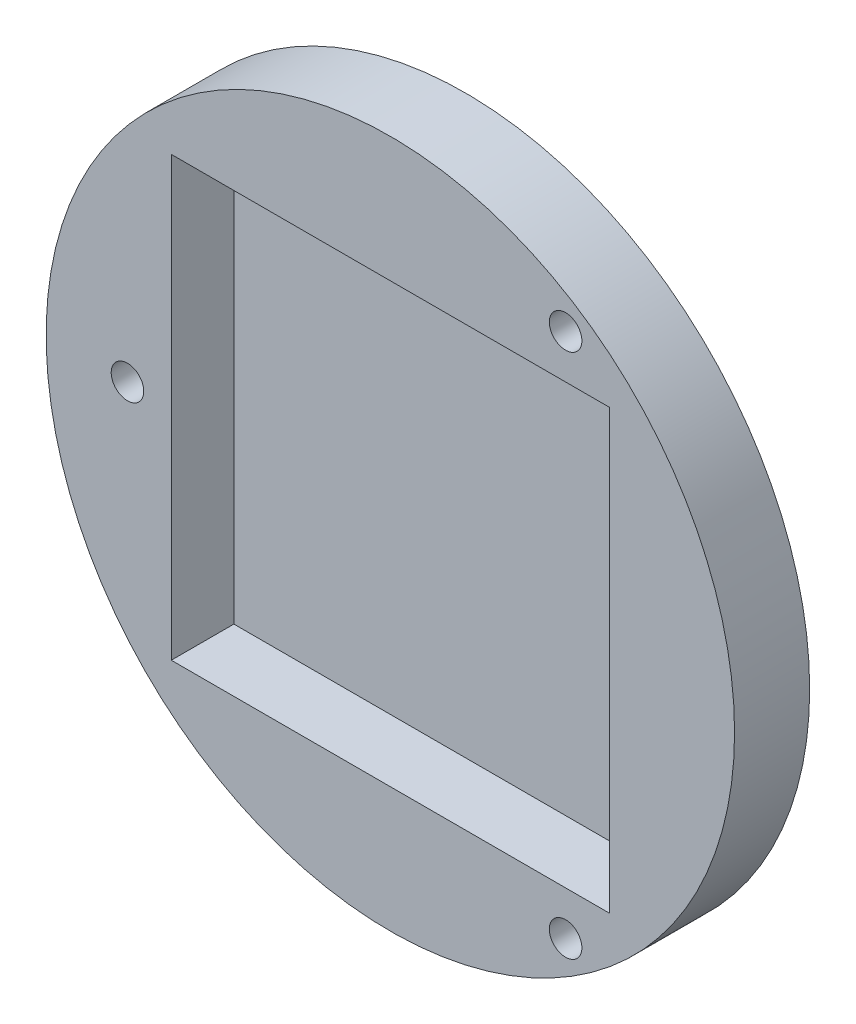
ISO-10303-21;
HEADER;
FILE_DESCRIPTION(('STEP AP214'),'2;1');
FILE_NAME('part.step','',(''),(''),'','','');
FILE_SCHEMA(('AUTOMOTIVE_DESIGN { 1 0 10303 214 1 1 1 1 }'));
ENDSEC;
DATA;
#1=APPLICATION_CONTEXT('core data for automotive mechanical design processes');
#2=APPLICATION_PROTOCOL_DEFINITION('international standard','automotive_design',2000,#1);
#3=PRODUCT_CONTEXT('',#1,'mechanical');
#4=PRODUCT('Part','Part','',(#3));
#5=PRODUCT_RELATED_PRODUCT_CATEGORY('part','',(#4));
#6=PRODUCT_DEFINITION_FORMATION('','',#4);
#7=PRODUCT_DEFINITION_CONTEXT('part definition',#1,'design');
#8=PRODUCT_DEFINITION('design','',#6,#7);
#9=PRODUCT_DEFINITION_SHAPE('','',#8);
#10=(LENGTH_UNIT() NAMED_UNIT(*) SI_UNIT(.MILLI.,.METRE.));
#11=(NAMED_UNIT(*) PLANE_ANGLE_UNIT() SI_UNIT($,.RADIAN.));
#12=(NAMED_UNIT(*) SI_UNIT($,.STERADIAN.) SOLID_ANGLE_UNIT());
#13=UNCERTAINTY_MEASURE_WITH_UNIT(LENGTH_MEASURE(1.E-05),#10,'distance_accuracy_value','');
#14=(GEOMETRIC_REPRESENTATION_CONTEXT(3) GLOBAL_UNCERTAINTY_ASSIGNED_CONTEXT((#13)) GLOBAL_UNIT_ASSIGNED_CONTEXT((#10,
#11,#12)) REPRESENTATION_CONTEXT('',''));
#15=CARTESIAN_POINT('',(0.,0.,0.));
#16=DIRECTION('',(0.,0.,1.));
#17=DIRECTION('',(1.,0.,0.));
#18=AXIS2_PLACEMENT_3D('',#15,#16,#17);
#19=CARTESIAN_POINT('',(0.,17.5,6.));
#20=DIRECTION('',(0.,1.,0.));
#21=DIRECTION('',(0.,0.,1.));
#22=AXIS2_PLACEMENT_3D('',#19,#20,#21);
#23=PLANE('',#22);
#24=DIRECTION('',(0.,0.,-1.));
#25=VECTOR('',#24,1.);
#26=CARTESIAN_POINT('',(-17.5,17.5,6.));
#27=LINE('',#26,#25);
#28=CARTESIAN_POINT('',(-17.5,17.5,6.));
#29=VERTEX_POINT('',#28);
#30=CARTESIAN_POINT('',(-17.5,17.5,1.));
#31=VERTEX_POINT('',#30);
#32=EDGE_CURVE('E99',#29,#31,#27,.T.);
#33=ORIENTED_EDGE('',*,*,#32,.T.);
#34=DIRECTION('',(1.,0.,0.));
#35=VECTOR('',#34,1.);
#36=CARTESIAN_POINT('',(0.,17.5,1.));
#37=LINE('',#36,#35);
#38=CARTESIAN_POINT('',(17.5,17.5,1.));
#39=VERTEX_POINT('',#38);
#40=EDGE_CURVE('E61',#31,#39,#37,.T.);
#41=ORIENTED_EDGE('',*,*,#40,.T.);
#42=DIRECTION('',(0.,0.,-1.));
#43=VECTOR('',#42,1.);
#44=CARTESIAN_POINT('',(17.5,17.5,6.));
#45=LINE('',#44,#43);
#46=CARTESIAN_POINT('',(17.5,17.5,6.));
#47=VERTEX_POINT('',#46);
#48=EDGE_CURVE('E11',#47,#39,#45,.T.);
#49=ORIENTED_EDGE('',*,*,#48,.F.);
#50=DIRECTION('',(1.,0.,0.));
#51=VECTOR('',#50,1.);
#52=CARTESIAN_POINT('',(0.,17.5,6.));
#53=LINE('',#52,#51);
#54=EDGE_CURVE('E119',#29,#47,#53,.T.);
#55=ORIENTED_EDGE('',*,*,#54,.F.);
#56=EDGE_LOOP('',(#33,#41,#49,#55));
#57=FACE_BOUND('',#56,.T.);
#58=ADVANCED_FACE('F43',(#57),#23,.F.);
#59=CARTESIAN_POINT('',(17.5,0.,6.));
#60=DIRECTION('',(1.,0.,0.));
#61=DIRECTION('',(0.,0.,-1.));
#62=AXIS2_PLACEMENT_3D('',#59,#60,#61);
#63=PLANE('',#62);
#64=ORIENTED_EDGE('',*,*,#48,.T.);
#65=DIRECTION('',(0.,-1.,0.));
#66=VECTOR('',#65,1.);
#67=CARTESIAN_POINT('',(17.5,0.,1.));
#68=LINE('',#67,#66);
#69=CARTESIAN_POINT('',(17.5,-17.5,1.));
#70=VERTEX_POINT('',#69);
#71=EDGE_CURVE('E67',#39,#70,#68,.T.);
#72=ORIENTED_EDGE('',*,*,#71,.T.);
#73=DIRECTION('',(0.,0.,-1.));
#74=VECTOR('',#73,1.);
#75=CARTESIAN_POINT('',(17.5,-17.5,6.));
#76=LINE('',#75,#74);
#77=CARTESIAN_POINT('',(17.5,-17.5,6.));
#78=VERTEX_POINT('',#77);
#79=EDGE_CURVE('E53',#78,#70,#76,.T.);
#80=ORIENTED_EDGE('',*,*,#79,.F.);
#81=DIRECTION('',(0.,-1.,0.));
#82=VECTOR('',#81,1.);
#83=CARTESIAN_POINT('',(17.5,0.,6.));
#84=LINE('',#83,#82);
#85=EDGE_CURVE('E123',#47,#78,#84,.T.);
#86=ORIENTED_EDGE('',*,*,#85,.F.);
#87=EDGE_LOOP('',(#64,#72,#80,#86));
#88=FACE_BOUND('',#87,.T.);
#89=ADVANCED_FACE('F184',(#88),#63,.F.);
#90=CARTESIAN_POINT('',(0.,-17.5,6.));
#91=DIRECTION('',(0.,1.,0.));
#92=DIRECTION('',(0.,0.,1.));
#93=AXIS2_PLACEMENT_3D('',#90,#91,#92);
#94=PLANE('',#93);
#95=DIRECTION('',(1.,0.,0.));
#96=VECTOR('',#95,1.);
#97=CARTESIAN_POINT('',(0.,-17.5,1.));
#98=LINE('',#97,#96);
#99=CARTESIAN_POINT('',(-17.5,-17.5,1.));
#100=VERTEX_POINT('',#99);
#101=EDGE_CURVE('E102',#100,#70,#98,.T.);
#102=ORIENTED_EDGE('',*,*,#101,.F.);
#103=DIRECTION('',(0.,0.,-1.));
#104=VECTOR('',#103,1.);
#105=CARTESIAN_POINT('',(-17.5,-17.5,6.));
#106=LINE('',#105,#104);
#107=CARTESIAN_POINT('',(-17.5,-17.5,6.));
#108=VERTEX_POINT('',#107);
#109=EDGE_CURVE('E88',#108,#100,#106,.T.);
#110=ORIENTED_EDGE('',*,*,#109,.F.);
#111=DIRECTION('',(1.,0.,0.));
#112=VECTOR('',#111,1.);
#113=CARTESIAN_POINT('',(0.,-17.5,6.));
#114=LINE('',#113,#112);
#115=EDGE_CURVE('E126',#108,#78,#114,.T.);
#116=ORIENTED_EDGE('',*,*,#115,.T.);
#117=ORIENTED_EDGE('',*,*,#79,.T.);
#118=EDGE_LOOP('',(#102,#110,#116,#117));
#119=FACE_BOUND('',#118,.T.);
#120=ADVANCED_FACE('F103',(#119),#94,.T.);
#121=CARTESIAN_POINT('',(0.,0.,6.));
#122=DIRECTION('',(0.,0.,-1.));
#123=DIRECTION('',(-1.,0.,0.));
#124=AXIS2_PLACEMENT_3D('',#121,#122,#123);
#125=CYLINDRICAL_SURFACE('',#124,27.5);
#126=CARTESIAN_POINT('',(0.,0.,6.));
#127=DIRECTION('',(0.,0.,1.));
#128=DIRECTION('',(1.,0.,0.));
#129=AXIS2_PLACEMENT_3D('',#126,#127,#128);
#130=CIRCLE('',#129,27.5);
#131=CARTESIAN_POINT('',(27.5,0.,6.));
#132=VERTEX_POINT('',#131);
#133=EDGE_CURVE('E115',#132,#132,#130,.T.);
#134=ORIENTED_EDGE('',*,*,#133,.F.);
#135=EDGE_LOOP('',(#134));
#136=FACE_BOUND('',#135,.T.);
#137=CARTESIAN_POINT('',(0.,0.,0.));
#138=DIRECTION('',(0.,0.,1.));
#139=DIRECTION('',(1.,0.,0.));
#140=AXIS2_PLACEMENT_3D('',#137,#138,#139);
#141=CIRCLE('',#140,27.5);
#142=CARTESIAN_POINT('',(27.5,0.,0.));
#143=VERTEX_POINT('',#142);
#144=EDGE_CURVE('E106',#143,#143,#141,.T.);
#145=ORIENTED_EDGE('',*,*,#144,.T.);
#146=EDGE_LOOP('',(#145));
#147=FACE_BOUND('',#146,.T.);
#148=ADVANCED_FACE('F45',(#136,#147),#125,.T.);
#149=CARTESIAN_POINT('',(-17.5,0.,6.));
#150=DIRECTION('',(1.,0.,0.));
#151=DIRECTION('',(0.,0.,-1.));
#152=AXIS2_PLACEMENT_3D('',#149,#150,#151);
#153=PLANE('',#152);
#154=DIRECTION('',(0.,-1.,0.));
#155=VECTOR('',#154,1.);
#156=CARTESIAN_POINT('',(-17.5,0.,1.));
#157=LINE('',#156,#155);
#158=EDGE_CURVE('E92',#31,#100,#157,.T.);
#159=ORIENTED_EDGE('',*,*,#158,.F.);
#160=ORIENTED_EDGE('',*,*,#32,.F.);
#161=DIRECTION('',(0.,-1.,0.));
#162=VECTOR('',#161,1.);
#163=CARTESIAN_POINT('',(-17.5,0.,6.));
#164=LINE('',#163,#162);
#165=EDGE_CURVE('E94',#29,#108,#164,.T.);
#166=ORIENTED_EDGE('',*,*,#165,.T.);
#167=ORIENTED_EDGE('',*,*,#109,.T.);
#168=EDGE_LOOP('',(#159,#160,#166,#167));
#169=FACE_BOUND('',#168,.T.);
#170=ADVANCED_FACE('F90',(#169),#153,.T.);
#171=CARTESIAN_POINT('',(0.,0.,6.));
#172=DIRECTION('',(0.,0.,1.));
#173=DIRECTION('',(1.,0.,0.));
#174=AXIS2_PLACEMENT_3D('',#171,#172,#173);
#175=PLANE('',#174);
#176=CARTESIAN_POINT('',(-21.,0.,6.));
#177=DIRECTION('',(0.,0.,1.));
#178=DIRECTION('',(1.,0.,0.));
#179=AXIS2_PLACEMENT_3D('',#176,#177,#178);
#180=CIRCLE('',#179,1.3);
#181=CARTESIAN_POINT('',(-19.7,0.,6.));
#182=VERTEX_POINT('',#181);
#183=EDGE_CURVE('E159',#182,#182,#180,.T.);
#184=ORIENTED_EDGE('',*,*,#183,.F.);
#185=EDGE_LOOP('',(#184));
#186=FACE_BOUND('',#185,.T.);
#187=CARTESIAN_POINT('',(14.,-21.,6.));
#188=DIRECTION('',(0.,0.,1.));
#189=DIRECTION('',(1.,0.,0.));
#190=AXIS2_PLACEMENT_3D('',#187,#188,#189);
#191=CIRCLE('',#190,1.3);
#192=CARTESIAN_POINT('',(15.3,-21.,6.));
#193=VERTEX_POINT('',#192);
#194=EDGE_CURVE('E146',#193,#193,#191,.T.);
#195=ORIENTED_EDGE('',*,*,#194,.F.);
#196=EDGE_LOOP('',(#195));
#197=FACE_BOUND('',#196,.T.);
#198=CARTESIAN_POINT('',(14.,21.,6.));
#199=DIRECTION('',(0.,0.,1.));
#200=DIRECTION('',(1.,0.,0.));
#201=AXIS2_PLACEMENT_3D('',#198,#199,#200);
#202=CIRCLE('',#201,1.3);
#203=CARTESIAN_POINT('',(15.3,21.,6.));
#204=VERTEX_POINT('',#203);
#205=EDGE_CURVE('E142',#204,#204,#202,.T.);
#206=ORIENTED_EDGE('',*,*,#205,.F.);
#207=EDGE_LOOP('',(#206));
#208=FACE_BOUND('',#207,.T.);
#209=ORIENTED_EDGE('',*,*,#133,.T.);
#210=EDGE_LOOP('',(#209));
#211=FACE_BOUND('',#210,.T.);
#212=ORIENTED_EDGE('',*,*,#54,.T.);
#213=ORIENTED_EDGE('',*,*,#85,.T.);
#214=ORIENTED_EDGE('',*,*,#115,.F.);
#215=ORIENTED_EDGE('',*,*,#165,.F.);
#216=EDGE_LOOP('',(#212,#213,#214,#215));
#217=FACE_BOUND('',#216,.T.);
#218=ADVANCED_FACE('F172',(#186,#197,#208,#211,#217),#175,.T.);
#219=CARTESIAN_POINT('',(0.,0.,0.));
#220=DIRECTION('',(0.,0.,1.));
#221=DIRECTION('',(1.,0.,0.));
#222=AXIS2_PLACEMENT_3D('',#219,#220,#221);
#223=PLANE('',#222);
#224=CARTESIAN_POINT('',(-21.,0.,0.));
#225=DIRECTION('',(0.,0.,1.));
#226=DIRECTION('',(1.,0.,0.));
#227=AXIS2_PLACEMENT_3D('',#224,#225,#226);
#228=CIRCLE('',#227,1.3);
#229=CARTESIAN_POINT('',(-19.7,0.,0.));
#230=VERTEX_POINT('',#229);
#231=EDGE_CURVE('E47',#230,#230,#228,.T.);
#232=ORIENTED_EDGE('',*,*,#231,.T.);
#233=EDGE_LOOP('',(#232));
#234=FACE_BOUND('',#233,.T.);
#235=CARTESIAN_POINT('',(14.,-21.,0.));
#236=DIRECTION('',(0.,0.,1.));
#237=DIRECTION('',(1.,0.,0.));
#238=AXIS2_PLACEMENT_3D('',#235,#236,#237);
#239=CIRCLE('',#238,1.3);
#240=CARTESIAN_POINT('',(15.3,-21.,0.));
#241=VERTEX_POINT('',#240);
#242=EDGE_CURVE('E143',#241,#241,#239,.T.);
#243=ORIENTED_EDGE('',*,*,#242,.T.);
#244=EDGE_LOOP('',(#243));
#245=FACE_BOUND('',#244,.T.);
#246=CARTESIAN_POINT('',(14.,21.,0.));
#247=DIRECTION('',(0.,0.,1.));
#248=DIRECTION('',(1.,0.,0.));
#249=AXIS2_PLACEMENT_3D('',#246,#247,#248);
#250=CIRCLE('',#249,1.3);
#251=CARTESIAN_POINT('',(15.3,21.,0.));
#252=VERTEX_POINT('',#251);
#253=EDGE_CURVE('E138',#252,#252,#250,.T.);
#254=ORIENTED_EDGE('',*,*,#253,.T.);
#255=EDGE_LOOP('',(#254));
#256=FACE_BOUND('',#255,.T.);
#257=CARTESIAN_POINT('',(0.,0.,0.));
#258=DIRECTION('',(0.,0.,-1.));
#259=DIRECTION('',(-1.,0.,0.));
#260=AXIS2_PLACEMENT_3D('',#257,#258,#259);
#261=CIRCLE('',#260,6.5);
#262=CARTESIAN_POINT('',(-6.5,0.,0.));
#263=VERTEX_POINT('',#262);
#264=EDGE_CURVE('E141',#263,#263,#261,.T.);
#265=ORIENTED_EDGE('',*,*,#264,.F.);
#266=EDGE_LOOP('',(#265));
#267=FACE_BOUND('',#266,.T.);
#268=ORIENTED_EDGE('',*,*,#144,.F.);
#269=EDGE_LOOP('',(#268));
#270=FACE_BOUND('',#269,.T.);
#271=ADVANCED_FACE('F169',(#234,#245,#256,#267,#270),#223,.F.);
#272=CARTESIAN_POINT('',(0.,0.,1.));
#273=DIRECTION('',(0.,0.,1.));
#274=DIRECTION('',(1.,0.,0.));
#275=AXIS2_PLACEMENT_3D('',#272,#273,#274);
#276=PLANE('',#275);
#277=ORIENTED_EDGE('',*,*,#71,.F.);
#278=ORIENTED_EDGE('',*,*,#40,.F.);
#279=ORIENTED_EDGE('',*,*,#158,.T.);
#280=ORIENTED_EDGE('',*,*,#101,.T.);
#281=EDGE_LOOP('',(#277,#278,#279,#280));
#282=FACE_BOUND('',#281,.T.);
#283=ADVANCED_FACE('F108',(#282),#276,.T.);
#284=CARTESIAN_POINT('',(0.,0.,0.));
#285=DIRECTION('',(0.,0.,-1.));
#286=DIRECTION('',(1.,0.,0.));
#287=AXIS2_PLACEMENT_3D('',#284,#285,#286);
#288=SPHERICAL_SURFACE('',#287,6.5);
#289=ORIENTED_EDGE('',*,*,#264,.T.);
#290=EDGE_LOOP('',(#289));
#291=FACE_BOUND('',#290,.T.);
#292=ADVANCED_FACE('F167',(#291),#288,.T.);
#293=CARTESIAN_POINT('',(14.,21.,6.));
#294=DIRECTION('',(0.,0.,1.));
#295=DIRECTION('',(1.,0.,0.));
#296=AXIS2_PLACEMENT_3D('',#293,#294,#295);
#297=CYLINDRICAL_SURFACE('',#296,1.3);
#298=ORIENTED_EDGE('',*,*,#205,.T.);
#299=EDGE_LOOP('',(#298));
#300=FACE_BOUND('',#299,.T.);
#301=ORIENTED_EDGE('',*,*,#253,.F.);
#302=EDGE_LOOP('',(#301));
#303=FACE_BOUND('',#302,.T.);
#304=ADVANCED_FACE('F200',(#300,#303),#297,.F.);
#305=CARTESIAN_POINT('',(14.,-21.,6.));
#306=DIRECTION('',(0.,0.,1.));
#307=DIRECTION('',(1.,0.,0.));
#308=AXIS2_PLACEMENT_3D('',#305,#306,#307);
#309=CYLINDRICAL_SURFACE('',#308,1.3);
#310=ORIENTED_EDGE('',*,*,#194,.T.);
#311=EDGE_LOOP('',(#310));
#312=FACE_BOUND('',#311,.T.);
#313=ORIENTED_EDGE('',*,*,#242,.F.);
#314=EDGE_LOOP('',(#313));
#315=FACE_BOUND('',#314,.T.);
#316=ADVANCED_FACE('F203',(#312,#315),#309,.F.);
#317=CARTESIAN_POINT('',(-21.,0.,6.));
#318=DIRECTION('',(0.,0.,1.));
#319=DIRECTION('',(1.,0.,0.));
#320=AXIS2_PLACEMENT_3D('',#317,#318,#319);
#321=CYLINDRICAL_SURFACE('',#320,1.3);
#322=ORIENTED_EDGE('',*,*,#183,.T.);
#323=EDGE_LOOP('',(#322));
#324=FACE_BOUND('',#323,.T.);
#325=ORIENTED_EDGE('',*,*,#231,.F.);
#326=EDGE_LOOP('',(#325));
#327=FACE_BOUND('',#326,.T.);
#328=ADVANCED_FACE('F207',(#324,#327),#321,.F.);
#329=CLOSED_SHELL('',(#58,#89,#120,#148,#170,#218,#271,#283,#292,#304,#316,#328));
#330=MANIFOLD_SOLID_BREP('B2',#329);
#331=ADVANCED_BREP_SHAPE_REPRESENTATION('',(#18,#330),#14);
#332=SHAPE_DEFINITION_REPRESENTATION(#9,#331);
ENDSEC;
END-ISO-10303-21;
